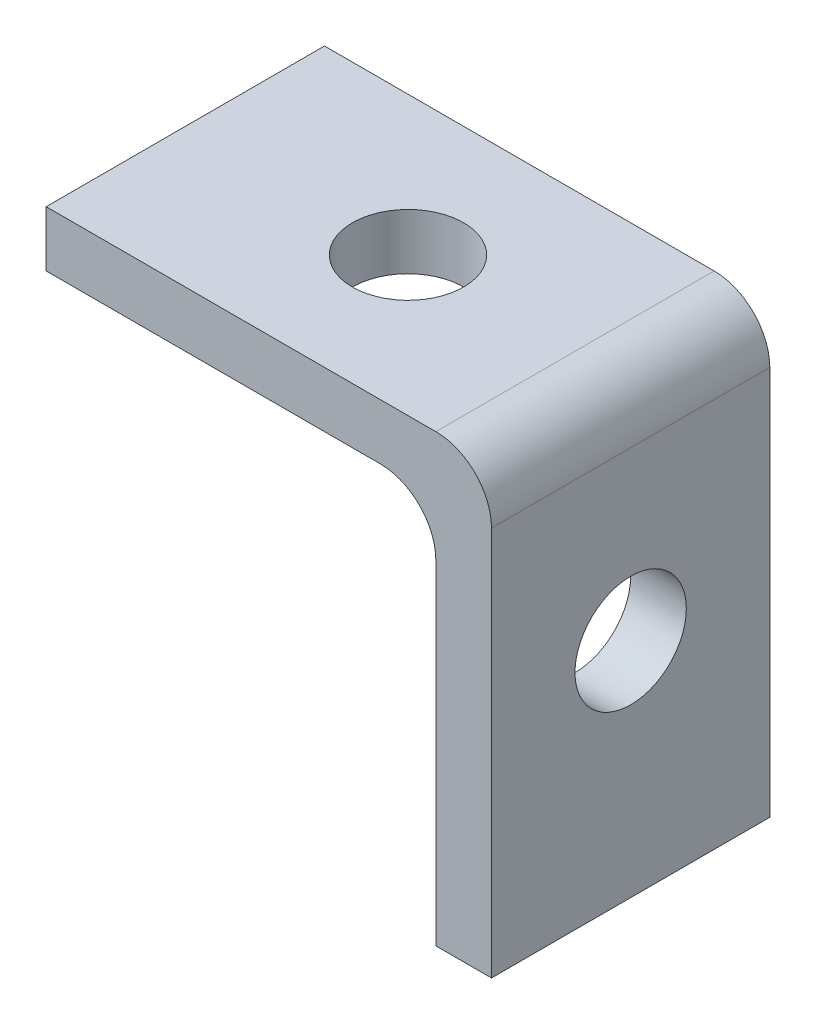
ISO-10303-21;
HEADER;
FILE_DESCRIPTION(('STEP AP214'),'2;1');
FILE_NAME('part.step','',(''),(''),'','','');
FILE_SCHEMA(('AUTOMOTIVE_DESIGN { 1 0 10303 214 1 1 1 1 }'));
ENDSEC;
DATA;
#1=APPLICATION_CONTEXT('core data for automotive mechanical design processes');
#2=APPLICATION_PROTOCOL_DEFINITION('international standard','automotive_design',2000,#1);
#3=PRODUCT_CONTEXT('',#1,'mechanical');
#4=PRODUCT('Part','Part','',(#3));
#5=PRODUCT_RELATED_PRODUCT_CATEGORY('part','',(#4));
#6=PRODUCT_DEFINITION_FORMATION('','',#4);
#7=PRODUCT_DEFINITION_CONTEXT('part definition',#1,'design');
#8=PRODUCT_DEFINITION('design','',#6,#7);
#9=PRODUCT_DEFINITION_SHAPE('','',#8);
#10=(LENGTH_UNIT() NAMED_UNIT(*) SI_UNIT(.MILLI.,.METRE.));
#11=(NAMED_UNIT(*) PLANE_ANGLE_UNIT() SI_UNIT($,.RADIAN.));
#12=(NAMED_UNIT(*) SI_UNIT($,.STERADIAN.) SOLID_ANGLE_UNIT());
#13=UNCERTAINTY_MEASURE_WITH_UNIT(LENGTH_MEASURE(1.E-05),#10,'distance_accuracy_value','');
#14=(GEOMETRIC_REPRESENTATION_CONTEXT(3) GLOBAL_UNCERTAINTY_ASSIGNED_CONTEXT((#13)) GLOBAL_UNIT_ASSIGNED_CONTEXT((#10,
#11,#12)) REPRESENTATION_CONTEXT('',''));
#15=CARTESIAN_POINT('',(0.,0.,0.));
#16=DIRECTION('',(0.,0.,1.));
#17=DIRECTION('',(1.,0.,0.));
#18=AXIS2_PLACEMENT_3D('',#15,#16,#17);
#19=CARTESIAN_POINT('',(-9.6,0.,6.));
#20=DIRECTION('',(1.,0.,0.));
#21=DIRECTION('',(0.,0.,-1.));
#22=AXIS2_PLACEMENT_3D('',#19,#20,#21);
#23=PLANE('',#22);
#24=DIRECTION('',(0.,-1.,0.));
#25=VECTOR('',#24,1.);
#26=CARTESIAN_POINT('',(-9.6,0.,0.));
#27=LINE('',#26,#25);
#28=CARTESIAN_POINT('',(-9.6,0.,0.));
#29=VERTEX_POINT('',#28);
#30=CARTESIAN_POINT('',(-9.6,-1.2,0.));
#31=VERTEX_POINT('',#30);
#32=EDGE_CURVE('E129',#29,#31,#27,.T.);
#33=ORIENTED_EDGE('',*,*,#32,.T.);
#34=DIRECTION('',(0.,0.,-1.));
#35=VECTOR('',#34,1.);
#36=CARTESIAN_POINT('',(-9.6,-1.2,6.));
#37=LINE('',#36,#35);
#38=CARTESIAN_POINT('',(-9.6,-1.2,6.));
#39=VERTEX_POINT('',#38);
#40=EDGE_CURVE('E11',#39,#31,#37,.T.);
#41=ORIENTED_EDGE('',*,*,#40,.F.);
#42=DIRECTION('',(0.,-1.,0.));
#43=VECTOR('',#42,1.);
#44=CARTESIAN_POINT('',(-9.6,0.,6.));
#45=LINE('',#44,#43);
#46=CARTESIAN_POINT('',(-9.6,0.,6.));
#47=VERTEX_POINT('',#46);
#48=EDGE_CURVE('E144',#47,#39,#45,.T.);
#49=ORIENTED_EDGE('',*,*,#48,.F.);
#50=DIRECTION('',(0.,0.,-1.));
#51=VECTOR('',#50,1.);
#52=CARTESIAN_POINT('',(-9.6,0.,6.));
#53=LINE('',#52,#51);
#54=EDGE_CURVE('E125',#47,#29,#53,.T.);
#55=ORIENTED_EDGE('',*,*,#54,.T.);
#56=EDGE_LOOP('',(#33,#41,#49,#55));
#57=FACE_BOUND('',#56,.T.);
#58=ADVANCED_FACE('F33',(#57),#23,.F.);
#59=CARTESIAN_POINT('',(-2.40000000000001,-1.2,6.));
#60=DIRECTION('',(0.,1.,0.));
#61=DIRECTION('',(0.,0.,1.));
#62=AXIS2_PLACEMENT_3D('',#59,#60,#61);
#63=PLANE('',#62);
#64=CARTESIAN_POINT('',(-4.8,-1.2,3.));
#65=DIRECTION('',(0.,1.,0.));
#66=DIRECTION('',(0.,0.,1.));
#67=AXIS2_PLACEMENT_3D('',#64,#65,#66);
#68=CIRCLE('',#67,1.2);
#69=CARTESIAN_POINT('',(-4.8,-1.2,4.2));
#70=VERTEX_POINT('',#69);
#71=EDGE_CURVE('E133',#70,#70,#68,.T.);
#72=ORIENTED_EDGE('',*,*,#71,.T.);
#73=EDGE_LOOP('',(#72));
#74=FACE_BOUND('',#73,.T.);
#75=DIRECTION('',(1.,0.,0.));
#76=VECTOR('',#75,1.);
#77=CARTESIAN_POINT('',(-2.40000000000001,-1.2,0.));
#78=LINE('',#77,#76);
#79=CARTESIAN_POINT('',(-2.40000000000001,-1.2,0.));
#80=VERTEX_POINT('',#79);
#81=EDGE_CURVE('E132',#31,#80,#78,.T.);
#82=ORIENTED_EDGE('',*,*,#81,.T.);
#83=DIRECTION('',(0.,0.,-1.));
#84=VECTOR('',#83,1.);
#85=CARTESIAN_POINT('',(-2.40000000000001,-1.2,6.));
#86=LINE('',#85,#84);
#87=CARTESIAN_POINT('',(-2.40000000000001,-1.2,6.));
#88=VERTEX_POINT('',#87);
#89=EDGE_CURVE('E41',#88,#80,#86,.T.);
#90=ORIENTED_EDGE('',*,*,#89,.F.);
#91=DIRECTION('',(1.,0.,0.));
#92=VECTOR('',#91,1.);
#93=CARTESIAN_POINT('',(-2.40000000000001,-1.2,6.));
#94=LINE('',#93,#92);
#95=EDGE_CURVE('E92',#39,#88,#94,.T.);
#96=ORIENTED_EDGE('',*,*,#95,.F.);
#97=ORIENTED_EDGE('',*,*,#40,.T.);
#98=EDGE_LOOP('',(#82,#90,#96,#97));
#99=FACE_BOUND('',#98,.T.);
#100=ADVANCED_FACE('F202',(#74,#99),#63,.F.);
#101=CARTESIAN_POINT('',(-2.4,-2.4,6.));
#102=DIRECTION('',(0.,0.,-1.));
#103=DIRECTION('',(-1.,0.,0.));
#104=AXIS2_PLACEMENT_3D('',#101,#102,#103);
#105=CYLINDRICAL_SURFACE('',#104,1.2);
#106=CARTESIAN_POINT('',(-2.4,-2.4,0.));
#107=DIRECTION('',(0.,0.,-1.));
#108=DIRECTION('',(1.,0.,0.));
#109=AXIS2_PLACEMENT_3D('',#106,#107,#108);
#110=CIRCLE('',#109,1.2);
#111=CARTESIAN_POINT('',(-1.2,-2.40000000000001,0.));
#112=VERTEX_POINT('',#111);
#113=EDGE_CURVE('E135',#80,#112,#110,.T.);
#114=ORIENTED_EDGE('',*,*,#113,.T.);
#115=DIRECTION('',(0.,0.,-1.));
#116=VECTOR('',#115,1.);
#117=CARTESIAN_POINT('',(-1.2,-2.40000000000001,6.));
#118=LINE('',#117,#116);
#119=CARTESIAN_POINT('',(-1.2,-2.40000000000001,6.));
#120=VERTEX_POINT('',#119);
#121=EDGE_CURVE('E151',#120,#112,#118,.T.);
#122=ORIENTED_EDGE('',*,*,#121,.F.);
#123=CARTESIAN_POINT('',(-2.4,-2.4,6.));
#124=DIRECTION('',(0.,0.,-1.));
#125=DIRECTION('',(1.,0.,0.));
#126=AXIS2_PLACEMENT_3D('',#123,#124,#125);
#127=CIRCLE('',#126,1.2);
#128=EDGE_CURVE('E159',#88,#120,#127,.T.);
#129=ORIENTED_EDGE('',*,*,#128,.F.);
#130=ORIENTED_EDGE('',*,*,#89,.T.);
#131=EDGE_LOOP('',(#114,#122,#129,#130));
#132=FACE_BOUND('',#131,.T.);
#133=ADVANCED_FACE('F157',(#132),#105,.F.);
#134=CARTESIAN_POINT('',(-1.2,-9.6,6.));
#135=DIRECTION('',(1.,0.,0.));
#136=DIRECTION('',(0.,0.,-1.));
#137=AXIS2_PLACEMENT_3D('',#134,#135,#136);
#138=PLANE('',#137);
#139=CARTESIAN_POINT('',(-1.2,-4.8,3.));
#140=DIRECTION('',(1.,0.,0.));
#141=DIRECTION('',(0.,0.,-1.));
#142=AXIS2_PLACEMENT_3D('',#139,#140,#141);
#143=CIRCLE('',#142,1.2);
#144=CARTESIAN_POINT('',(-1.2,-4.8,1.8));
#145=VERTEX_POINT('',#144);
#146=EDGE_CURVE('E182',#145,#145,#143,.T.);
#147=ORIENTED_EDGE('',*,*,#146,.T.);
#148=EDGE_LOOP('',(#147));
#149=FACE_BOUND('',#148,.T.);
#150=DIRECTION('',(0.,-1.,0.));
#151=VECTOR('',#150,1.);
#152=CARTESIAN_POINT('',(-1.2,-9.6,0.));
#153=LINE('',#152,#151);
#154=CARTESIAN_POINT('',(-1.2,-9.6,0.));
#155=VERTEX_POINT('',#154);
#156=EDGE_CURVE('E137',#112,#155,#153,.T.);
#157=ORIENTED_EDGE('',*,*,#156,.T.);
#158=DIRECTION('',(0.,0.,-1.));
#159=VECTOR('',#158,1.);
#160=CARTESIAN_POINT('',(-1.2,-9.6,6.));
#161=LINE('',#160,#159);
#162=CARTESIAN_POINT('',(-1.2,-9.6,6.));
#163=VERTEX_POINT('',#162);
#164=EDGE_CURVE('E148',#163,#155,#161,.T.);
#165=ORIENTED_EDGE('',*,*,#164,.F.);
#166=DIRECTION('',(0.,-1.,0.));
#167=VECTOR('',#166,1.);
#168=CARTESIAN_POINT('',(-1.2,-9.6,6.));
#169=LINE('',#168,#167);
#170=EDGE_CURVE('E171',#120,#163,#169,.T.);
#171=ORIENTED_EDGE('',*,*,#170,.F.);
#172=ORIENTED_EDGE('',*,*,#121,.T.);
#173=EDGE_LOOP('',(#157,#165,#171,#172));
#174=FACE_BOUND('',#173,.T.);
#175=ADVANCED_FACE('F167',(#149,#174),#138,.F.);
#176=CARTESIAN_POINT('',(0.,-9.6,6.));
#177=DIRECTION('',(0.,1.,0.));
#178=DIRECTION('',(0.,0.,1.));
#179=AXIS2_PLACEMENT_3D('',#176,#177,#178);
#180=PLANE('',#179);
#181=DIRECTION('',(1.,0.,0.));
#182=VECTOR('',#181,1.);
#183=CARTESIAN_POINT('',(0.,-9.6,0.));
#184=LINE('',#183,#182);
#185=CARTESIAN_POINT('',(0.,-9.6,0.));
#186=VERTEX_POINT('',#185);
#187=EDGE_CURVE('E139',#155,#186,#184,.T.);
#188=ORIENTED_EDGE('',*,*,#187,.T.);
#189=DIRECTION('',(0.,0.,-1.));
#190=VECTOR('',#189,1.);
#191=CARTESIAN_POINT('',(0.,-9.6,6.));
#192=LINE('',#191,#190);
#193=CARTESIAN_POINT('',(0.,-9.6,6.));
#194=VERTEX_POINT('',#193);
#195=EDGE_CURVE('E120',#194,#186,#192,.T.);
#196=ORIENTED_EDGE('',*,*,#195,.F.);
#197=DIRECTION('',(1.,0.,0.));
#198=VECTOR('',#197,1.);
#199=CARTESIAN_POINT('',(0.,-9.6,6.));
#200=LINE('',#199,#198);
#201=EDGE_CURVE('E111',#163,#194,#200,.T.);
#202=ORIENTED_EDGE('',*,*,#201,.F.);
#203=ORIENTED_EDGE('',*,*,#164,.T.);
#204=EDGE_LOOP('',(#188,#196,#202,#203));
#205=FACE_BOUND('',#204,.T.);
#206=ADVANCED_FACE('F170',(#205),#180,.F.);
#207=CARTESIAN_POINT('',(0.,-1.20000000000001,6.));
#208=DIRECTION('',(-1.,0.,0.));
#209=DIRECTION('',(0.,-1.,0.));
#210=AXIS2_PLACEMENT_3D('',#207,#208,#209);
#211=PLANE('',#210);
#212=CARTESIAN_POINT('',(0.,-4.8,3.));
#213=DIRECTION('',(1.,0.,0.));
#214=DIRECTION('',(0.,0.,-1.));
#215=AXIS2_PLACEMENT_3D('',#212,#213,#214);
#216=CIRCLE('',#215,1.2);
#217=CARTESIAN_POINT('',(0.,-4.8,1.8));
#218=VERTEX_POINT('',#217);
#219=EDGE_CURVE('E185',#218,#218,#216,.T.);
#220=ORIENTED_EDGE('',*,*,#219,.F.);
#221=EDGE_LOOP('',(#220));
#222=FACE_BOUND('',#221,.T.);
#223=DIRECTION('',(0.,1.,0.));
#224=VECTOR('',#223,1.);
#225=CARTESIAN_POINT('',(0.,-1.20000000000001,0.));
#226=LINE('',#225,#224);
#227=CARTESIAN_POINT('',(0.,-1.20000000000001,0.));
#228=VERTEX_POINT('',#227);
#229=EDGE_CURVE('E119',#186,#228,#226,.T.);
#230=ORIENTED_EDGE('',*,*,#229,.T.);
#231=DIRECTION('',(0.,0.,-1.));
#232=VECTOR('',#231,1.);
#233=CARTESIAN_POINT('',(0.,-1.20000000000001,6.));
#234=LINE('',#233,#232);
#235=CARTESIAN_POINT('',(0.,-1.20000000000001,6.));
#236=VERTEX_POINT('',#235);
#237=EDGE_CURVE('E116',#236,#228,#234,.T.);
#238=ORIENTED_EDGE('',*,*,#237,.F.);
#239=DIRECTION('',(0.,1.,0.));
#240=VECTOR('',#239,1.);
#241=CARTESIAN_POINT('',(0.,-1.20000000000001,6.));
#242=LINE('',#241,#240);
#243=EDGE_CURVE('E105',#194,#236,#242,.T.);
#244=ORIENTED_EDGE('',*,*,#243,.F.);
#245=ORIENTED_EDGE('',*,*,#195,.T.);
#246=EDGE_LOOP('',(#230,#238,#244,#245));
#247=FACE_BOUND('',#246,.T.);
#248=ADVANCED_FACE('F117',(#222,#247),#211,.F.);
#249=CARTESIAN_POINT('',(-1.2,-1.2,6.));
#250=DIRECTION('',(0.,0.,-1.));
#251=DIRECTION('',(-1.,0.,0.));
#252=AXIS2_PLACEMENT_3D('',#249,#250,#251);
#253=CYLINDRICAL_SURFACE('',#252,1.2);
#254=CARTESIAN_POINT('',(-1.2,-1.2,0.));
#255=DIRECTION('',(0.,0.,1.));
#256=DIRECTION('',(1.,0.,0.));
#257=AXIS2_PLACEMENT_3D('',#254,#255,#256);
#258=CIRCLE('',#257,1.2);
#259=CARTESIAN_POINT('',(-1.20000000000001,0.,0.));
#260=VERTEX_POINT('',#259);
#261=EDGE_CURVE('E78',#228,#260,#258,.T.);
#262=ORIENTED_EDGE('',*,*,#261,.T.);
#263=DIRECTION('',(0.,0.,-1.));
#264=VECTOR('',#263,1.);
#265=CARTESIAN_POINT('',(-1.20000000000001,0.,6.));
#266=LINE('',#265,#264);
#267=CARTESIAN_POINT('',(-1.20000000000001,0.,6.));
#268=VERTEX_POINT('',#267);
#269=EDGE_CURVE('E121',#268,#260,#266,.T.);
#270=ORIENTED_EDGE('',*,*,#269,.F.);
#271=CARTESIAN_POINT('',(-1.2,-1.2,6.));
#272=DIRECTION('',(0.,0.,1.));
#273=DIRECTION('',(1.,0.,0.));
#274=AXIS2_PLACEMENT_3D('',#271,#272,#273);
#275=CIRCLE('',#274,1.2);
#276=EDGE_CURVE('E109',#236,#268,#275,.T.);
#277=ORIENTED_EDGE('',*,*,#276,.F.);
#278=ORIENTED_EDGE('',*,*,#237,.T.);
#279=EDGE_LOOP('',(#262,#270,#277,#278));
#280=FACE_BOUND('',#279,.T.);
#281=ADVANCED_FACE('F123',(#280),#253,.T.);
#282=CARTESIAN_POINT('',(-1.20000000000001,0.,6.));
#283=DIRECTION('',(0.,-1.,0.));
#284=DIRECTION('',(0.,0.,-1.));
#285=AXIS2_PLACEMENT_3D('',#282,#283,#284);
#286=PLANE('',#285);
#287=CARTESIAN_POINT('',(-4.8,0.,3.));
#288=DIRECTION('',(0.,1.,0.));
#289=DIRECTION('',(0.,0.,1.));
#290=AXIS2_PLACEMENT_3D('',#287,#288,#289);
#291=CIRCLE('',#290,1.2);
#292=CARTESIAN_POINT('',(-4.8,0.,4.2));
#293=VERTEX_POINT('',#292);
#294=EDGE_CURVE('E179',#293,#293,#291,.T.);
#295=ORIENTED_EDGE('',*,*,#294,.F.);
#296=EDGE_LOOP('',(#295));
#297=FACE_BOUND('',#296,.T.);
#298=DIRECTION('',(-1.,0.,0.));
#299=VECTOR('',#298,1.);
#300=CARTESIAN_POINT('',(-1.20000000000001,0.,0.));
#301=LINE('',#300,#299);
#302=EDGE_CURVE('E84',#260,#29,#301,.T.);
#303=ORIENTED_EDGE('',*,*,#302,.T.);
#304=ORIENTED_EDGE('',*,*,#54,.F.);
#305=DIRECTION('',(-1.,0.,0.));
#306=VECTOR('',#305,1.);
#307=CARTESIAN_POINT('',(-1.20000000000001,0.,6.));
#308=LINE('',#307,#306);
#309=EDGE_CURVE('E49',#268,#47,#308,.T.);
#310=ORIENTED_EDGE('',*,*,#309,.F.);
#311=ORIENTED_EDGE('',*,*,#269,.T.);
#312=EDGE_LOOP('',(#303,#304,#310,#311));
#313=FACE_BOUND('',#312,.T.);
#314=ADVANCED_FACE('F198',(#297,#313),#286,.F.);
#315=CARTESIAN_POINT('',(-2.4,-2.4,6.));
#316=DIRECTION('',(0.,0.,1.));
#317=DIRECTION('',(1.,0.,0.));
#318=AXIS2_PLACEMENT_3D('',#315,#316,#317);
#319=PLANE('',#318);
#320=ORIENTED_EDGE('',*,*,#48,.T.);
#321=ORIENTED_EDGE('',*,*,#95,.T.);
#322=ORIENTED_EDGE('',*,*,#128,.T.);
#323=ORIENTED_EDGE('',*,*,#170,.T.);
#324=ORIENTED_EDGE('',*,*,#201,.T.);
#325=ORIENTED_EDGE('',*,*,#243,.T.);
#326=ORIENTED_EDGE('',*,*,#276,.T.);
#327=ORIENTED_EDGE('',*,*,#309,.T.);
#328=EDGE_LOOP('',(#320,#321,#322,#323,#324,#325,#326,#327));
#329=FACE_BOUND('',#328,.T.);
#330=ADVANCED_FACE('F107',(#329),#319,.T.);
#331=CARTESIAN_POINT('',(-2.4,-2.4,0.));
#332=DIRECTION('',(0.,0.,1.));
#333=DIRECTION('',(1.,0.,0.));
#334=AXIS2_PLACEMENT_3D('',#331,#332,#333);
#335=PLANE('',#334);
#336=ORIENTED_EDGE('',*,*,#32,.F.);
#337=ORIENTED_EDGE('',*,*,#302,.F.);
#338=ORIENTED_EDGE('',*,*,#261,.F.);
#339=ORIENTED_EDGE('',*,*,#229,.F.);
#340=ORIENTED_EDGE('',*,*,#187,.F.);
#341=ORIENTED_EDGE('',*,*,#156,.F.);
#342=ORIENTED_EDGE('',*,*,#113,.F.);
#343=ORIENTED_EDGE('',*,*,#81,.F.);
#344=EDGE_LOOP('',(#336,#337,#338,#339,#340,#341,#342,#343));
#345=FACE_BOUND('',#344,.T.);
#346=ADVANCED_FACE('F163',(#345),#335,.F.);
#347=CARTESIAN_POINT('',(-4.8,-6.,3.));
#348=DIRECTION('',(0.,1.,0.));
#349=DIRECTION('',(0.,0.,1.));
#350=AXIS2_PLACEMENT_3D('',#347,#348,#349);
#351=CYLINDRICAL_SURFACE('',#350,1.2);
#352=ORIENTED_EDGE('',*,*,#294,.T.);
#353=EDGE_LOOP('',(#352));
#354=FACE_BOUND('',#353,.T.);
#355=ORIENTED_EDGE('',*,*,#71,.F.);
#356=EDGE_LOOP('',(#355));
#357=FACE_BOUND('',#356,.T.);
#358=ADVANCED_FACE('F220',(#354,#357),#351,.F.);
#359=CARTESIAN_POINT('',(-6.,-4.8,3.));
#360=DIRECTION('',(1.,0.,0.));
#361=DIRECTION('',(0.,0.,-1.));
#362=AXIS2_PLACEMENT_3D('',#359,#360,#361);
#363=CYLINDRICAL_SURFACE('',#362,1.2);
#364=ORIENTED_EDGE('',*,*,#219,.T.);
#365=EDGE_LOOP('',(#364));
#366=FACE_BOUND('',#365,.T.);
#367=ORIENTED_EDGE('',*,*,#146,.F.);
#368=EDGE_LOOP('',(#367));
#369=FACE_BOUND('',#368,.T.);
#370=ADVANCED_FACE('F189',(#366,#369),#363,.F.);
#371=CLOSED_SHELL('',(#58,#100,#133,#175,#206,#248,#281,#314,#330,#346,#358,#370));
#372=MANIFOLD_SOLID_BREP('B2',#371);
#373=ADVANCED_BREP_SHAPE_REPRESENTATION('',(#18,#372),#14);
#374=SHAPE_DEFINITION_REPRESENTATION(#9,#373);
ENDSEC;
END-ISO-10303-21;
